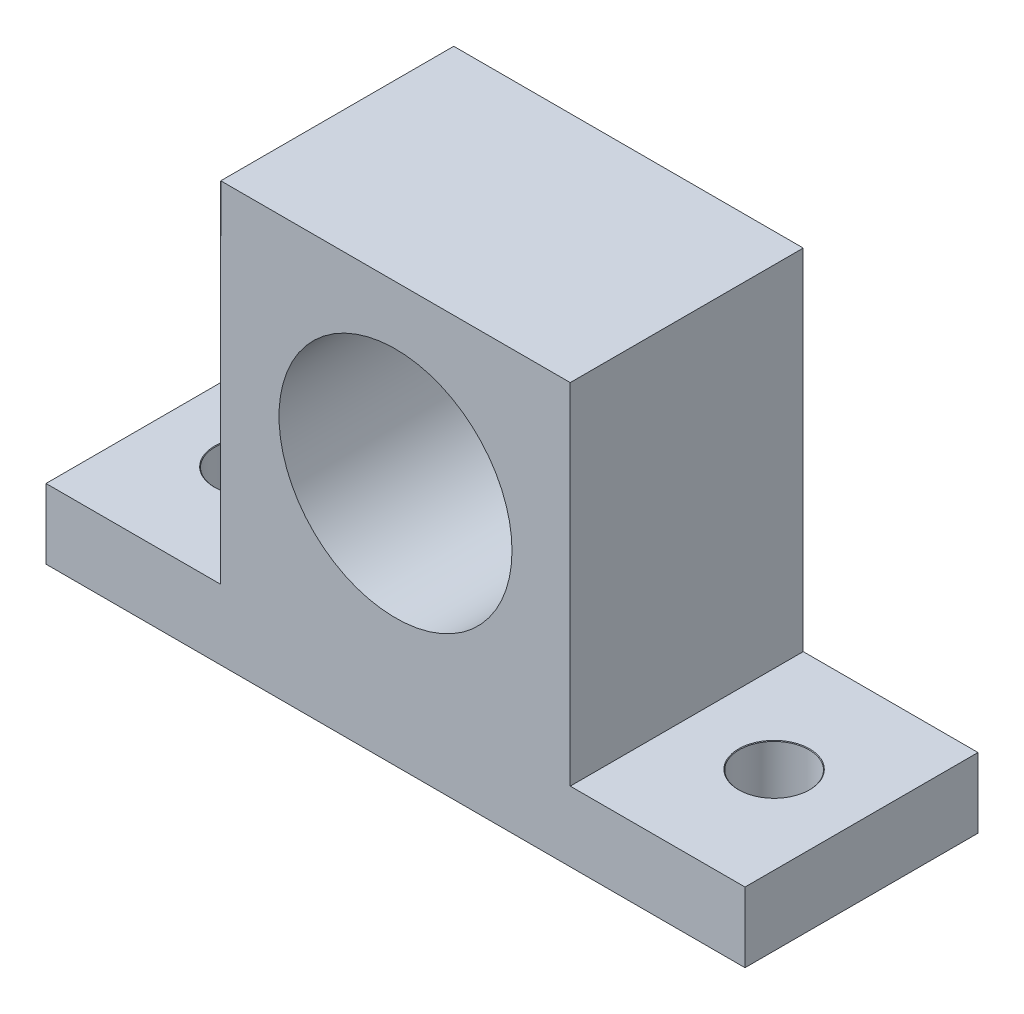
ISO-10303-21;
HEADER;
FILE_DESCRIPTION(('STEP AP214'),'2;1');
FILE_NAME('part.step','',(''),(''),'','','');
FILE_SCHEMA(('AUTOMOTIVE_DESIGN { 1 0 10303 214 1 1 1 1 }'));
ENDSEC;
DATA;
#1=APPLICATION_CONTEXT('core data for automotive mechanical design processes');
#2=APPLICATION_PROTOCOL_DEFINITION('international standard','automotive_design',2000,#1);
#3=PRODUCT_CONTEXT('',#1,'mechanical');
#4=PRODUCT('Part','Part','',(#3));
#5=PRODUCT_RELATED_PRODUCT_CATEGORY('part','',(#4));
#6=PRODUCT_DEFINITION_FORMATION('','',#4);
#7=PRODUCT_DEFINITION_CONTEXT('part definition',#1,'design');
#8=PRODUCT_DEFINITION('design','',#6,#7);
#9=PRODUCT_DEFINITION_SHAPE('','',#8);
#10=(LENGTH_UNIT() NAMED_UNIT(*) SI_UNIT(.MILLI.,.METRE.));
#11=(NAMED_UNIT(*) PLANE_ANGLE_UNIT() SI_UNIT($,.RADIAN.));
#12=(NAMED_UNIT(*) SI_UNIT($,.STERADIAN.) SOLID_ANGLE_UNIT());
#13=UNCERTAINTY_MEASURE_WITH_UNIT(LENGTH_MEASURE(1.E-05),#10,'distance_accuracy_value','');
#14=(GEOMETRIC_REPRESENTATION_CONTEXT(3) GLOBAL_UNCERTAINTY_ASSIGNED_CONTEXT((#13)) GLOBAL_UNIT_ASSIGNED_CONTEXT((#10,
#11,#12)) REPRESENTATION_CONTEXT('',''));
#15=CARTESIAN_POINT('',(0.,0.,0.));
#16=DIRECTION('',(0.,0.,1.));
#17=DIRECTION('',(1.,0.,0.));
#18=AXIS2_PLACEMENT_3D('',#15,#16,#17);
#19=CARTESIAN_POINT('',(0.,3.,0.));
#20=DIRECTION('',(0.,1.,0.));
#21=DIRECTION('',(0.,0.,1.));
#22=AXIS2_PLACEMENT_3D('',#19,#20,#21);
#23=PLANE('',#22);
#24=CARTESIAN_POINT('',(-109.796511627907,3.,47.8239202657807));
#25=DIRECTION('',(0.,1.,0.));
#26=DIRECTION('',(0.,0.,1.));
#27=AXIS2_PLACEMENT_3D('',#24,#25,#26);
#28=CIRCLE('',#27,1.525);
#29=CARTESIAN_POINT('',(-109.796511627907,3.,49.3489202657806));
#30=VERTEX_POINT('',#29);
#31=EDGE_CURVE('E362',#30,#30,#28,.T.);
#32=ORIENTED_EDGE('',*,*,#31,.F.);
#33=EDGE_LOOP('',(#32));
#34=FACE_BOUND('',#33,.T.);
#35=DIRECTION('',(-1.,0.,0.));
#36=VECTOR('',#35,1.);
#37=CARTESIAN_POINT('',(-136.046511627907,3.,42.8239202657807));
#38=LINE('',#37,#36);
#39=CARTESIAN_POINT('',(-106.046511627907,3.,42.8239202657807));
#40=VERTEX_POINT('',#39);
#41=CARTESIAN_POINT('',(-113.546511627907,3.,42.8239202657807));
#42=VERTEX_POINT('',#41);
#43=EDGE_CURVE('E72',#40,#42,#38,.T.);
#44=ORIENTED_EDGE('',*,*,#43,.T.);
#45=DIRECTION('',(0.,0.,1.));
#46=VECTOR('',#45,1.);
#47=CARTESIAN_POINT('',(-113.546511627907,3.,0.));
#48=LINE('',#47,#46);
#49=CARTESIAN_POINT('',(-113.546511627907,3.,52.8239202657807));
#50=VERTEX_POINT('',#49);
#51=EDGE_CURVE('E116',#42,#50,#48,.T.);
#52=ORIENTED_EDGE('',*,*,#51,.T.);
#53=DIRECTION('',(1.,0.,0.));
#54=VECTOR('',#53,1.);
#55=CARTESIAN_POINT('',(-136.046511627907,3.,52.8239202657807));
#56=LINE('',#55,#54);
#57=CARTESIAN_POINT('',(-106.046511627907,3.,52.8239202657807));
#58=VERTEX_POINT('',#57);
#59=EDGE_CURVE('E167',#50,#58,#56,.T.);
#60=ORIENTED_EDGE('',*,*,#59,.T.);
#61=DIRECTION('',(0.,0.,-1.));
#62=VECTOR('',#61,1.);
#63=CARTESIAN_POINT('',(-106.046511627907,3.,42.8239202657807));
#64=LINE('',#63,#62);
#65=EDGE_CURVE('E172',#58,#40,#64,.T.);
#66=ORIENTED_EDGE('',*,*,#65,.T.);
#67=EDGE_LOOP('',(#44,#52,#60,#66));
#68=FACE_BOUND('',#67,.T.);
#69=ADVANCED_FACE('F50',(#34,#68),#23,.T.);
#70=CARTESIAN_POINT('',(-136.046511627907,3.,42.8239202657807));
#71=DIRECTION('',(1.,0.,0.));
#72=DIRECTION('',(0.,0.,-1.));
#73=AXIS2_PLACEMENT_3D('',#70,#71,#72);
#74=PLANE('',#73);
#75=DIRECTION('',(0.,0.,1.));
#76=VECTOR('',#75,1.);
#77=CARTESIAN_POINT('',(-136.046511627907,0.,42.8239202657807));
#78=LINE('',#77,#76);
#79=CARTESIAN_POINT('',(-136.046511627907,0.,42.8239202657807));
#80=VERTEX_POINT('',#79);
#81=CARTESIAN_POINT('',(-136.046511627907,0.,52.8239202657807));
#82=VERTEX_POINT('',#81);
#83=EDGE_CURVE('E125',#80,#82,#78,.T.);
#84=ORIENTED_EDGE('',*,*,#83,.T.);
#85=DIRECTION('',(0.,-1.,0.));
#86=VECTOR('',#85,1.);
#87=CARTESIAN_POINT('',(-136.046511627907,3.,52.8239202657807));
#88=LINE('',#87,#86);
#89=CARTESIAN_POINT('',(-136.046511627907,3.,52.8239202657807));
#90=VERTEX_POINT('',#89);
#91=EDGE_CURVE('E11',#90,#82,#88,.T.);
#92=ORIENTED_EDGE('',*,*,#91,.F.);
#93=DIRECTION('',(0.,0.,1.));
#94=VECTOR('',#93,1.);
#95=CARTESIAN_POINT('',(-136.046511627907,3.,42.8239202657807));
#96=LINE('',#95,#94);
#97=CARTESIAN_POINT('',(-136.046511627907,3.,42.8239202657807));
#98=VERTEX_POINT('',#97);
#99=EDGE_CURVE('E165',#98,#90,#96,.T.);
#100=ORIENTED_EDGE('',*,*,#99,.F.);
#101=DIRECTION('',(0.,-1.,0.));
#102=VECTOR('',#101,1.);
#103=CARTESIAN_POINT('',(-136.046511627907,3.,42.8239202657807));
#104=LINE('',#103,#102);
#105=EDGE_CURVE('E180',#98,#80,#104,.T.);
#106=ORIENTED_EDGE('',*,*,#105,.T.);
#107=EDGE_LOOP('',(#84,#92,#100,#106));
#108=FACE_BOUND('',#107,.T.);
#109=ADVANCED_FACE('F47',(#108),#74,.F.);
#110=CARTESIAN_POINT('',(-136.046511627907,3.,52.8239202657807));
#111=DIRECTION('',(0.,0.,-1.));
#112=DIRECTION('',(-1.,0.,0.));
#113=AXIS2_PLACEMENT_3D('',#110,#111,#112);
#114=PLANE('',#113);
#115=CARTESIAN_POINT('',(-121.046511627907,10.5,52.8239202657807));
#116=DIRECTION('',(0.,0.,1.));
#117=DIRECTION('',(1.,0.,0.));
#118=AXIS2_PLACEMENT_3D('',#115,#116,#117);
#119=CIRCLE('',#118,5.);
#120=CARTESIAN_POINT('',(-116.046511627907,10.5,52.8239202657807));
#121=VERTEX_POINT('',#120);
#122=EDGE_CURVE('E141',#121,#121,#119,.T.);
#123=ORIENTED_EDGE('',*,*,#122,.F.);
#124=EDGE_LOOP('',(#123));
#125=FACE_BOUND('',#124,.T.);
#126=DIRECTION('',(1.,0.,0.));
#127=VECTOR('',#126,1.);
#128=CARTESIAN_POINT('',(-136.046511627907,0.,52.8239202657807));
#129=LINE('',#128,#127);
#130=CARTESIAN_POINT('',(-106.046511627907,0.,52.8239202657807));
#131=VERTEX_POINT('',#130);
#132=EDGE_CURVE('E182',#82,#131,#129,.T.);
#133=ORIENTED_EDGE('',*,*,#132,.T.);
#134=DIRECTION('',(0.,-1.,0.));
#135=VECTOR('',#134,1.);
#136=CARTESIAN_POINT('',(-106.046511627907,3.,52.8239202657807));
#137=LINE('',#136,#135);
#138=EDGE_CURVE('E57',#58,#131,#137,.T.);
#139=ORIENTED_EDGE('',*,*,#138,.F.);
#140=ORIENTED_EDGE('',*,*,#59,.F.);
#141=DIRECTION('',(0.,-1.,0.));
#142=VECTOR('',#141,1.);
#143=CARTESIAN_POINT('',(-113.546511627907,18.,52.8239202657807));
#144=LINE('',#143,#142);
#145=CARTESIAN_POINT('',(-113.546511627907,18.,52.8239202657807));
#146=VERTEX_POINT('',#145);
#147=EDGE_CURVE('E147',#146,#50,#144,.T.);
#148=ORIENTED_EDGE('',*,*,#147,.F.);
#149=DIRECTION('',(1.,0.,0.));
#150=VECTOR('',#149,1.);
#151=CARTESIAN_POINT('',(0.,18.,52.8239202657807));
#152=LINE('',#151,#150);
#153=CARTESIAN_POINT('',(-128.546511627907,18.,52.8239202657807));
#154=VERTEX_POINT('',#153);
#155=EDGE_CURVE('E138',#154,#146,#152,.T.);
#156=ORIENTED_EDGE('',*,*,#155,.F.);
#157=DIRECTION('',(0.,-1.,0.));
#158=VECTOR('',#157,1.);
#159=CARTESIAN_POINT('',(-128.546511627907,18.,52.8239202657807));
#160=LINE('',#159,#158);
#161=CARTESIAN_POINT('',(-128.546511627907,3.,52.8239202657807));
#162=VERTEX_POINT('',#161);
#163=EDGE_CURVE('E156',#154,#162,#160,.T.);
#164=ORIENTED_EDGE('',*,*,#163,.T.);
#165=EDGE_CURVE('E169',#90,#162,#56,.T.);
#166=ORIENTED_EDGE('',*,*,#165,.F.);
#167=ORIENTED_EDGE('',*,*,#91,.T.);
#168=EDGE_LOOP('',(#133,#139,#140,#148,#156,#164,#166,#167));
#169=FACE_BOUND('',#168,.T.);
#170=ADVANCED_FACE('F216',(#125,#169),#114,.F.);
#171=CARTESIAN_POINT('',(-106.046511627907,3.,42.8239202657807));
#172=DIRECTION('',(-1.,0.,0.));
#173=DIRECTION('',(0.,0.,1.));
#174=AXIS2_PLACEMENT_3D('',#171,#172,#173);
#175=PLANE('',#174);
#176=DIRECTION('',(0.,0.,-1.));
#177=VECTOR('',#176,1.);
#178=CARTESIAN_POINT('',(-106.046511627907,0.,42.8239202657807));
#179=LINE('',#178,#177);
#180=CARTESIAN_POINT('',(-106.046511627907,0.,42.8239202657807));
#181=VERTEX_POINT('',#180);
#182=EDGE_CURVE('E184',#131,#181,#179,.T.);
#183=ORIENTED_EDGE('',*,*,#182,.T.);
#184=DIRECTION('',(0.,-1.,0.));
#185=VECTOR('',#184,1.);
#186=CARTESIAN_POINT('',(-106.046511627907,3.,42.8239202657807));
#187=LINE('',#186,#185);
#188=EDGE_CURVE('E195',#40,#181,#187,.T.);
#189=ORIENTED_EDGE('',*,*,#188,.F.);
#190=ORIENTED_EDGE('',*,*,#65,.F.);
#191=ORIENTED_EDGE('',*,*,#138,.T.);
#192=EDGE_LOOP('',(#183,#189,#190,#191));
#193=FACE_BOUND('',#192,.T.);
#194=ADVANCED_FACE('F203',(#193),#175,.F.);
#195=CARTESIAN_POINT('',(-136.046511627907,3.,42.8239202657807));
#196=DIRECTION('',(0.,0.,1.));
#197=DIRECTION('',(1.,0.,0.));
#198=AXIS2_PLACEMENT_3D('',#195,#196,#197);
#199=PLANE('',#198);
#200=CARTESIAN_POINT('',(-121.046511627907,10.5,42.8239202657807));
#201=DIRECTION('',(0.,0.,1.));
#202=DIRECTION('',(1.,0.,0.));
#203=AXIS2_PLACEMENT_3D('',#200,#201,#202);
#204=CIRCLE('',#203,5.);
#205=CARTESIAN_POINT('',(-116.046511627907,10.5,42.8239202657807));
#206=VERTEX_POINT('',#205);
#207=EDGE_CURVE('E155',#206,#206,#204,.T.);
#208=ORIENTED_EDGE('',*,*,#207,.T.);
#209=EDGE_LOOP('',(#208));
#210=FACE_BOUND('',#209,.T.);
#211=DIRECTION('',(-1.,0.,0.));
#212=VECTOR('',#211,1.);
#213=CARTESIAN_POINT('',(-136.046511627907,0.,42.8239202657807));
#214=LINE('',#213,#212);
#215=EDGE_CURVE('E170',#181,#80,#214,.T.);
#216=ORIENTED_EDGE('',*,*,#215,.T.);
#217=ORIENTED_EDGE('',*,*,#105,.F.);
#218=CARTESIAN_POINT('',(-128.546511627907,3.,42.8239202657807));
#219=VERTEX_POINT('',#218);
#220=EDGE_CURVE('E171',#219,#98,#38,.T.);
#221=ORIENTED_EDGE('',*,*,#220,.F.);
#222=DIRECTION('',(0.,-1.,0.));
#223=VECTOR('',#222,1.);
#224=CARTESIAN_POINT('',(-128.546511627907,18.,42.8239202657807));
#225=LINE('',#224,#223);
#226=CARTESIAN_POINT('',(-128.546511627907,18.,42.8239202657807));
#227=VERTEX_POINT('',#226);
#228=EDGE_CURVE('E121',#227,#219,#225,.T.);
#229=ORIENTED_EDGE('',*,*,#228,.F.);
#230=DIRECTION('',(-1.,0.,0.));
#231=VECTOR('',#230,1.);
#232=CARTESIAN_POINT('',(0.,18.,42.8239202657807));
#233=LINE('',#232,#231);
#234=CARTESIAN_POINT('',(-113.546511627907,18.,42.8239202657807));
#235=VERTEX_POINT('',#234);
#236=EDGE_CURVE('E127',#235,#227,#233,.T.);
#237=ORIENTED_EDGE('',*,*,#236,.F.);
#238=DIRECTION('',(0.,-1.,0.));
#239=VECTOR('',#238,1.);
#240=CARTESIAN_POINT('',(-113.546511627907,18.,42.8239202657807));
#241=LINE('',#240,#239);
#242=EDGE_CURVE('E114',#235,#42,#241,.T.);
#243=ORIENTED_EDGE('',*,*,#242,.T.);
#244=ORIENTED_EDGE('',*,*,#43,.F.);
#245=ORIENTED_EDGE('',*,*,#188,.T.);
#246=EDGE_LOOP('',(#216,#217,#221,#229,#237,#243,#244,#245));
#247=FACE_BOUND('',#246,.T.);
#248=ADVANCED_FACE('F130',(#210,#247),#199,.F.);
#249=CARTESIAN_POINT('',(-132.296511627907,3.,47.8239202657807));
#250=DIRECTION('',(0.,1.,0.));
#251=DIRECTION('',(0.,0.,1.));
#252=AXIS2_PLACEMENT_3D('',#249,#250,#251);
#253=CIRCLE('',#252,1.525);
#254=CARTESIAN_POINT('',(-132.296511627907,3.,49.3489202657806));
#255=VERTEX_POINT('',#254);
#256=EDGE_CURVE('E253',#255,#255,#253,.T.);
#257=ORIENTED_EDGE('',*,*,#256,.F.);
#258=EDGE_LOOP('',(#257));
#259=FACE_BOUND('',#258,.T.);
#260=DIRECTION('',(0.,0.,1.));
#261=VECTOR('',#260,1.);
#262=CARTESIAN_POINT('',(-128.546511627907,3.,0.));
#263=LINE('',#262,#261);
#264=EDGE_CURVE('E64',#219,#162,#263,.T.);
#265=ORIENTED_EDGE('',*,*,#264,.F.);
#266=ORIENTED_EDGE('',*,*,#220,.T.);
#267=ORIENTED_EDGE('',*,*,#99,.T.);
#268=ORIENTED_EDGE('',*,*,#165,.T.);
#269=EDGE_LOOP('',(#265,#266,#267,#268));
#270=FACE_BOUND('',#269,.T.);
#271=ADVANCED_FACE('F213',(#259,#270),#23,.T.);
#272=CARTESIAN_POINT('',(0.,0.,0.));
#273=DIRECTION('',(0.,1.,0.));
#274=DIRECTION('',(0.,0.,1.));
#275=AXIS2_PLACEMENT_3D('',#272,#273,#274);
#276=PLANE('',#275);
#277=CARTESIAN_POINT('',(-109.796511627907,0.,47.8239202657807));
#278=DIRECTION('',(0.,1.,0.));
#279=DIRECTION('',(0.,0.,1.));
#280=AXIS2_PLACEMENT_3D('',#277,#278,#279);
#281=CIRCLE('',#280,1.5);
#282=CARTESIAN_POINT('',(-109.796511627907,0.,49.3239202657807));
#283=VERTEX_POINT('',#282);
#284=EDGE_CURVE('E254',#283,#283,#281,.T.);
#285=ORIENTED_EDGE('',*,*,#284,.T.);
#286=EDGE_LOOP('',(#285));
#287=FACE_BOUND('',#286,.T.);
#288=CARTESIAN_POINT('',(-132.296511627907,0.,47.8239202657807));
#289=DIRECTION('',(0.,1.,0.));
#290=DIRECTION('',(0.,0.,1.));
#291=AXIS2_PLACEMENT_3D('',#288,#289,#290);
#292=CIRCLE('',#291,1.5);
#293=CARTESIAN_POINT('',(-132.296511627907,0.,49.3239202657807));
#294=VERTEX_POINT('',#293);
#295=EDGE_CURVE('E257',#294,#294,#292,.T.);
#296=ORIENTED_EDGE('',*,*,#295,.T.);
#297=EDGE_LOOP('',(#296));
#298=FACE_BOUND('',#297,.T.);
#299=ORIENTED_EDGE('',*,*,#83,.F.);
#300=ORIENTED_EDGE('',*,*,#215,.F.);
#301=ORIENTED_EDGE('',*,*,#182,.F.);
#302=ORIENTED_EDGE('',*,*,#132,.F.);
#303=EDGE_LOOP('',(#299,#300,#301,#302));
#304=FACE_BOUND('',#303,.T.);
#305=ADVANCED_FACE('F208',(#287,#298,#304),#276,.F.);
#306=CARTESIAN_POINT('',(-113.546511627907,18.,0.));
#307=DIRECTION('',(1.,0.,0.));
#308=DIRECTION('',(0.,0.,-1.));
#309=AXIS2_PLACEMENT_3D('',#306,#307,#308);
#310=PLANE('',#309);
#311=ORIENTED_EDGE('',*,*,#51,.F.);
#312=ORIENTED_EDGE('',*,*,#242,.F.);
#313=DIRECTION('',(0.,0.,1.));
#314=VECTOR('',#313,1.);
#315=CARTESIAN_POINT('',(-113.546511627907,18.,0.));
#316=LINE('',#315,#314);
#317=EDGE_CURVE('E119',#235,#146,#316,.T.);
#318=ORIENTED_EDGE('',*,*,#317,.T.);
#319=ORIENTED_EDGE('',*,*,#147,.T.);
#320=EDGE_LOOP('',(#311,#312,#318,#319));
#321=FACE_BOUND('',#320,.T.);
#322=ADVANCED_FACE('F113',(#321),#310,.T.);
#323=CARTESIAN_POINT('',(-128.546511627907,18.,0.));
#324=DIRECTION('',(1.,0.,0.));
#325=DIRECTION('',(0.,0.,-1.));
#326=AXIS2_PLACEMENT_3D('',#323,#324,#325);
#327=PLANE('',#326);
#328=ORIENTED_EDGE('',*,*,#264,.T.);
#329=ORIENTED_EDGE('',*,*,#163,.F.);
#330=DIRECTION('',(0.,0.,1.));
#331=VECTOR('',#330,1.);
#332=CARTESIAN_POINT('',(-128.546511627907,18.,0.));
#333=LINE('',#332,#331);
#334=EDGE_CURVE('E135',#227,#154,#333,.T.);
#335=ORIENTED_EDGE('',*,*,#334,.F.);
#336=ORIENTED_EDGE('',*,*,#228,.T.);
#337=EDGE_LOOP('',(#328,#329,#335,#336));
#338=FACE_BOUND('',#337,.T.);
#339=ADVANCED_FACE('F218',(#338),#327,.F.);
#340=CARTESIAN_POINT('',(0.,18.,0.));
#341=DIRECTION('',(0.,1.,0.));
#342=DIRECTION('',(0.,0.,1.));
#343=AXIS2_PLACEMENT_3D('',#340,#341,#342);
#344=PLANE('',#343);
#345=ORIENTED_EDGE('',*,*,#317,.F.);
#346=ORIENTED_EDGE('',*,*,#236,.T.);
#347=ORIENTED_EDGE('',*,*,#334,.T.);
#348=ORIENTED_EDGE('',*,*,#155,.T.);
#349=EDGE_LOOP('',(#345,#346,#347,#348));
#350=FACE_BOUND('',#349,.T.);
#351=ADVANCED_FACE('F131',(#350),#344,.T.);
#352=CARTESIAN_POINT('',(-121.046511627907,10.5,42.8239202657807));
#353=DIRECTION('',(0.,0.,1.));
#354=DIRECTION('',(1.,0.,0.));
#355=AXIS2_PLACEMENT_3D('',#352,#353,#354);
#356=CYLINDRICAL_SURFACE('',#355,5.);
#357=ORIENTED_EDGE('',*,*,#207,.F.);
#358=EDGE_LOOP('',(#357));
#359=FACE_BOUND('',#358,.T.);
#360=ORIENTED_EDGE('',*,*,#122,.T.);
#361=EDGE_LOOP('',(#360));
#362=FACE_BOUND('',#361,.T.);
#363=ADVANCED_FACE('F227',(#359,#362),#356,.F.);
#364=CARTESIAN_POINT('',(-132.296511627907,3.,47.8239202657807));
#365=DIRECTION('',(0.,1.,0.));
#366=DIRECTION('',(0.,0.,1.));
#367=AXIS2_PLACEMENT_3D('',#364,#365,#366);
#368=CYLINDRICAL_SURFACE('',#367,1.5);
#369=ORIENTED_EDGE('',*,*,#295,.F.);
#370=EDGE_LOOP('',(#369));
#371=FACE_BOUND('',#370,.T.);
#372=CARTESIAN_POINT('',(-132.296511627907,2.975,47.8239202657807));
#373=DIRECTION('',(0.,1.,0.));
#374=DIRECTION('',(0.,0.,1.));
#375=AXIS2_PLACEMENT_3D('',#372,#373,#374);
#376=CIRCLE('',#375,1.5);
#377=CARTESIAN_POINT('',(-132.296511627907,2.975,49.3239202657807));
#378=VERTEX_POINT('',#377);
#379=EDGE_CURVE('E255',#378,#378,#376,.T.);
#380=ORIENTED_EDGE('',*,*,#379,.T.);
#381=EDGE_LOOP('',(#380));
#382=FACE_BOUND('',#381,.T.);
#383=ADVANCED_FACE('F320',(#371,#382),#368,.F.);
#384=CARTESIAN_POINT('',(-132.296511627907,3.,47.8239202657807));
#385=DIRECTION('',(0.,1.,0.));
#386=DIRECTION('',(0.,0.,1.));
#387=AXIS2_PLACEMENT_3D('',#384,#385,#386);
#388=CONICAL_SURFACE('',#387,1.525,0.785398163397344);
#389=ORIENTED_EDGE('',*,*,#379,.F.);
#390=EDGE_LOOP('',(#389));
#391=FACE_BOUND('',#390,.T.);
#392=ORIENTED_EDGE('',*,*,#256,.T.);
#393=EDGE_LOOP('',(#392));
#394=FACE_BOUND('',#393,.T.);
#395=ADVANCED_FACE('F326',(#391,#394),#388,.F.);
#396=CARTESIAN_POINT('',(-109.796511627907,3.,47.8239202657807));
#397=DIRECTION('',(0.,1.,0.));
#398=DIRECTION('',(0.,0.,1.));
#399=AXIS2_PLACEMENT_3D('',#396,#397,#398);
#400=CYLINDRICAL_SURFACE('',#399,1.5);
#401=ORIENTED_EDGE('',*,*,#284,.F.);
#402=EDGE_LOOP('',(#401));
#403=FACE_BOUND('',#402,.T.);
#404=CARTESIAN_POINT('',(-109.796511627907,2.975,47.8239202657807));
#405=DIRECTION('',(0.,1.,0.));
#406=DIRECTION('',(0.,0.,1.));
#407=AXIS2_PLACEMENT_3D('',#404,#405,#406);
#408=CIRCLE('',#407,1.5);
#409=CARTESIAN_POINT('',(-109.796511627907,2.975,49.3239202657807));
#410=VERTEX_POINT('',#409);
#411=EDGE_CURVE('E263',#410,#410,#408,.T.);
#412=ORIENTED_EDGE('',*,*,#411,.T.);
#413=EDGE_LOOP('',(#412));
#414=FACE_BOUND('',#413,.T.);
#415=ADVANCED_FACE('F333',(#403,#414),#400,.F.);
#416=CARTESIAN_POINT('',(-109.796511627907,3.,47.8239202657807));
#417=DIRECTION('',(0.,1.,0.));
#418=DIRECTION('',(0.,0.,1.));
#419=AXIS2_PLACEMENT_3D('',#416,#417,#418);
#420=CONICAL_SURFACE('',#419,1.525,0.785398163397344);
#421=ORIENTED_EDGE('',*,*,#411,.F.);
#422=EDGE_LOOP('',(#421));
#423=FACE_BOUND('',#422,.T.);
#424=ORIENTED_EDGE('',*,*,#31,.T.);
#425=EDGE_LOOP('',(#424));
#426=FACE_BOUND('',#425,.T.);
#427=ADVANCED_FACE('F342',(#423,#426),#420,.F.);
#428=CLOSED_SHELL('',(#69,#109,#170,#194,#248,#271,#305,#322,#339,#351,#363,#383,#395,#415,#427));
#429=MANIFOLD_SOLID_BREP('B2',#428);
#430=ADVANCED_BREP_SHAPE_REPRESENTATION('',(#18,#429),#14);
#431=SHAPE_DEFINITION_REPRESENTATION(#9,#430);
ENDSEC;
END-ISO-10303-21;
